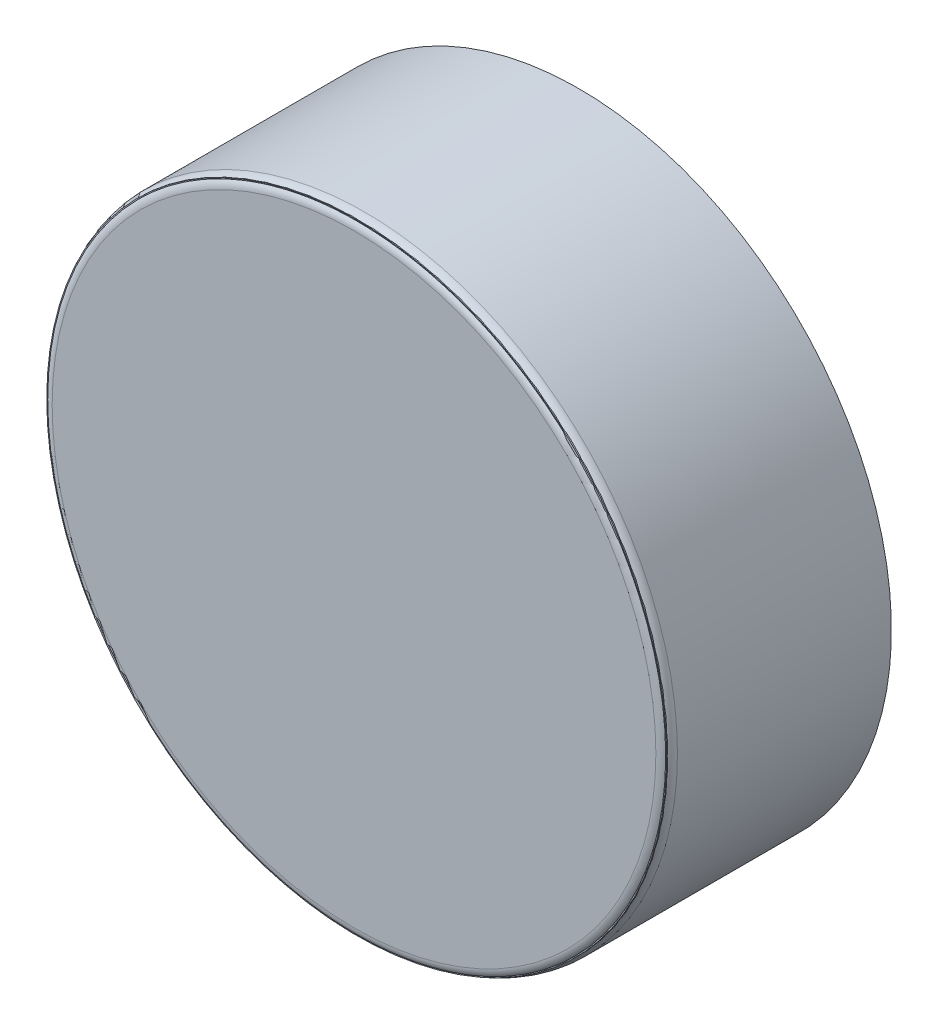
ISO-10303-21;
HEADER;
FILE_DESCRIPTION(('STEP AP214'),'2;1');
FILE_NAME('part.step','',(''),(''),'','','');
FILE_SCHEMA(('AUTOMOTIVE_DESIGN { 1 0 10303 214 1 1 1 1 }'));
ENDSEC;
DATA;
#1=APPLICATION_CONTEXT('core data for automotive mechanical design processes');
#2=APPLICATION_PROTOCOL_DEFINITION('international standard','automotive_design',2000,#1);
#3=PRODUCT_CONTEXT('',#1,'mechanical');
#4=PRODUCT('Part','Part','',(#3));
#5=PRODUCT_RELATED_PRODUCT_CATEGORY('part','',(#4));
#6=PRODUCT_DEFINITION_FORMATION('','',#4);
#7=PRODUCT_DEFINITION_CONTEXT('part definition',#1,'design');
#8=PRODUCT_DEFINITION('design','',#6,#7);
#9=PRODUCT_DEFINITION_SHAPE('','',#8);
#10=(LENGTH_UNIT() NAMED_UNIT(*) SI_UNIT(.MILLI.,.METRE.));
#11=(NAMED_UNIT(*) PLANE_ANGLE_UNIT() SI_UNIT($,.RADIAN.));
#12=(NAMED_UNIT(*) SI_UNIT($,.STERADIAN.) SOLID_ANGLE_UNIT());
#13=UNCERTAINTY_MEASURE_WITH_UNIT(LENGTH_MEASURE(1.E-05),#10,'distance_accuracy_value','');
#14=(GEOMETRIC_REPRESENTATION_CONTEXT(3) GLOBAL_UNCERTAINTY_ASSIGNED_CONTEXT((#13)) GLOBAL_UNIT_ASSIGNED_CONTEXT((#10,
#11,#12)) REPRESENTATION_CONTEXT('',''));
#15=CARTESIAN_POINT('',(0.,0.,0.));
#16=DIRECTION('',(0.,0.,1.));
#17=DIRECTION('',(1.,0.,0.));
#18=AXIS2_PLACEMENT_3D('',#15,#16,#17);
#19=CARTESIAN_POINT('',(0.,0.,0.635));
#20=DIRECTION('',(0.,0.,-1.));
#21=DIRECTION('',(-1.,0.,0.));
#22=AXIS2_PLACEMENT_3D('',#19,#20,#21);
#23=CYLINDRICAL_SURFACE('',#22,73.66);
#24=CARTESIAN_POINT('',(0.,0.,-1.905));
#25=DIRECTION('',(0.,0.,1.));
#26=DIRECTION('',(1.,0.,0.));
#27=AXIS2_PLACEMENT_3D('',#24,#25,#26);
#28=CIRCLE('',#27,73.66);
#29=CARTESIAN_POINT('',(73.66,0.,-1.905));
#30=VERTEX_POINT('',#29);
#31=EDGE_CURVE('E10',#30,#30,#28,.F.);
#32=ORIENTED_EDGE('',*,*,#31,.T.);
#33=EDGE_LOOP('',(#32));
#34=FACE_BOUND('',#33,.T.);
#35=CARTESIAN_POINT('',(0.,0.,-52.324));
#36=DIRECTION('',(0.,0.,-1.));
#37=DIRECTION('',(-1.,0.,0.));
#38=AXIS2_PLACEMENT_3D('',#35,#36,#37);
#39=CIRCLE('',#38,73.66);
#40=CARTESIAN_POINT('',(-73.66,0.,-52.324));
#41=VERTEX_POINT('',#40);
#42=EDGE_CURVE('E50',#41,#41,#39,.T.);
#43=ORIENTED_EDGE('',*,*,#42,.F.);
#44=EDGE_LOOP('',(#43));
#45=FACE_BOUND('',#44,.T.);
#46=ADVANCED_FACE('F37',(#34,#45),#23,.T.);
#47=CARTESIAN_POINT('',(0.,0.,0.635));
#48=DIRECTION('',(0.,0.,1.));
#49=DIRECTION('',(1.,0.,0.));
#50=AXIS2_PLACEMENT_3D('',#47,#48,#49);
#51=PLANE('',#50);
#52=CARTESIAN_POINT('',(0.,0.,0.635));
#53=DIRECTION('',(0.,0.,1.));
#54=DIRECTION('',(1.,0.,0.));
#55=AXIS2_PLACEMENT_3D('',#52,#53,#54);
#56=CIRCLE('',#55,71.12);
#57=CARTESIAN_POINT('',(71.12,0.,0.635));
#58=VERTEX_POINT('',#57);
#59=EDGE_CURVE('E45',#58,#58,#56,.T.);
#60=ORIENTED_EDGE('',*,*,#59,.T.);
#61=EDGE_LOOP('',(#60));
#62=FACE_BOUND('',#61,.T.);
#63=ADVANCED_FACE('F71',(#62),#51,.T.);
#64=CARTESIAN_POINT('',(0.,0.,-52.324));
#65=DIRECTION('',(0.,0.,-1.));
#66=DIRECTION('',(-1.,0.,0.));
#67=AXIS2_PLACEMENT_3D('',#64,#65,#66);
#68=PLANE('',#67);
#69=ORIENTED_EDGE('',*,*,#42,.T.);
#70=EDGE_LOOP('',(#69));
#71=FACE_BOUND('',#70,.T.);
#72=CARTESIAN_POINT('',(0.,0.,-52.324));
#73=DIRECTION('',(0.,0.,-1.));
#74=DIRECTION('',(-1.,0.,0.));
#75=AXIS2_PLACEMENT_3D('',#72,#73,#74);
#76=CIRCLE('',#75,73.025);
#77=CARTESIAN_POINT('',(-73.025,0.,-52.324));
#78=VERTEX_POINT('',#77);
#79=EDGE_CURVE('E55',#78,#78,#76,.T.);
#80=ORIENTED_EDGE('',*,*,#79,.F.);
#81=EDGE_LOOP('',(#80));
#82=FACE_BOUND('',#81,.T.);
#83=ADVANCED_FACE('F69',(#71,#82),#68,.T.);
#84=CARTESIAN_POINT('',(0.,0.,-52.324));
#85=DIRECTION('',(0.,0.,1.));
#86=DIRECTION('',(1.,0.,0.));
#87=AXIS2_PLACEMENT_3D('',#84,#85,#86);
#88=CYLINDRICAL_SURFACE('',#87,73.025);
#89=ORIENTED_EDGE('',*,*,#79,.T.);
#90=EDGE_LOOP('',(#89));
#91=FACE_BOUND('',#90,.T.);
#92=CARTESIAN_POINT('',(0.,0.,0.));
#93=DIRECTION('',(0.,0.,-1.));
#94=DIRECTION('',(-1.,0.,0.));
#95=AXIS2_PLACEMENT_3D('',#92,#93,#94);
#96=CIRCLE('',#95,73.025);
#97=CARTESIAN_POINT('',(-73.025,0.,0.));
#98=VERTEX_POINT('',#97);
#99=EDGE_CURVE('E58',#98,#98,#96,.T.);
#100=ORIENTED_EDGE('',*,*,#99,.F.);
#101=EDGE_LOOP('',(#100));
#102=FACE_BOUND('',#101,.T.);
#103=ADVANCED_FACE('F66',(#91,#102),#88,.F.);
#104=CARTESIAN_POINT('',(0.,0.,0.));
#105=DIRECTION('',(0.,0.,1.));
#106=DIRECTION('',(1.,0.,0.));
#107=AXIS2_PLACEMENT_3D('',#104,#105,#106);
#108=PLANE('',#107);
#109=ORIENTED_EDGE('',*,*,#99,.T.);
#110=EDGE_LOOP('',(#109));
#111=FACE_BOUND('',#110,.T.);
#112=ADVANCED_FACE('F78',(#111),#108,.F.);
#113=CARTESIAN_POINT('',(0.,0.,-1.905));
#114=DIRECTION('',(0.,0.,1.));
#115=DIRECTION('',(1.,0.,0.));
#116=AXIS2_PLACEMENT_3D('',#113,#114,#115);
#117=TOROIDAL_SURFACE('',#116,71.12,2.54);
#118=ORIENTED_EDGE('',*,*,#31,.F.);
#119=EDGE_LOOP('',(#118));
#120=FACE_BOUND('',#119,.T.);
#121=ORIENTED_EDGE('',*,*,#59,.F.);
#122=EDGE_LOOP('',(#121));
#123=FACE_BOUND('',#122,.T.);
#124=ADVANCED_FACE('F39',(#120,#123),#117,.T.);
#125=CLOSED_SHELL('',(#46,#63,#83,#103,#112,#124));
#126=MANIFOLD_SOLID_BREP('B2',#125);
#127=ADVANCED_BREP_SHAPE_REPRESENTATION('',(#18,#126),#14);
#128=SHAPE_DEFINITION_REPRESENTATION(#9,#127);
ENDSEC;
END-ISO-10303-21;
